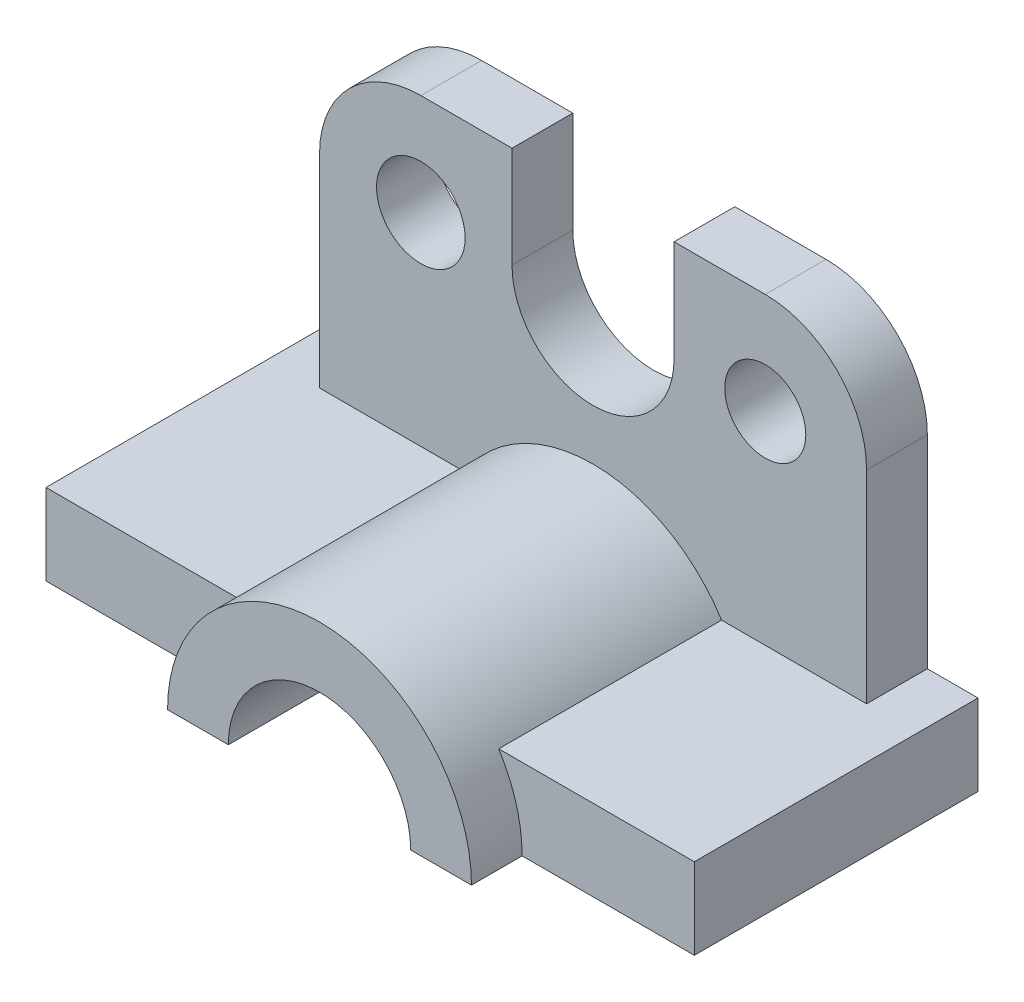
ISO-10303-21;
HEADER;
FILE_DESCRIPTION(('STEP AP214'),'2;1');
FILE_NAME('part.step','',(''),(''),'','','');
FILE_SCHEMA(('AUTOMOTIVE_DESIGN { 1 0 10303 214 1 1 1 1 }'));
ENDSEC;
DATA;
#1=APPLICATION_CONTEXT('core data for automotive mechanical design processes');
#2=APPLICATION_PROTOCOL_DEFINITION('international standard','automotive_design',2000,#1);
#3=PRODUCT_CONTEXT('',#1,'mechanical');
#4=PRODUCT('Part','Part','',(#3));
#5=PRODUCT_RELATED_PRODUCT_CATEGORY('part','',(#4));
#6=PRODUCT_DEFINITION_FORMATION('','',#4);
#7=PRODUCT_DEFINITION_CONTEXT('part definition',#1,'design');
#8=PRODUCT_DEFINITION('design','',#6,#7);
#9=PRODUCT_DEFINITION_SHAPE('','',#8);
#10=(LENGTH_UNIT() NAMED_UNIT(*) SI_UNIT(.MILLI.,.METRE.));
#11=(NAMED_UNIT(*) PLANE_ANGLE_UNIT() SI_UNIT($,.RADIAN.));
#12=(NAMED_UNIT(*) SI_UNIT($,.STERADIAN.) SOLID_ANGLE_UNIT());
#13=UNCERTAINTY_MEASURE_WITH_UNIT(LENGTH_MEASURE(1.E-05),#10,'distance_accuracy_value','');
#14=(GEOMETRIC_REPRESENTATION_CONTEXT(3) GLOBAL_UNCERTAINTY_ASSIGNED_CONTEXT((#13)) GLOBAL_UNIT_ASSIGNED_CONTEXT((#10,
#11,#12)) REPRESENTATION_CONTEXT('',''));
#15=CARTESIAN_POINT('',(0.,0.,0.));
#16=DIRECTION('',(0.,0.,1.));
#17=DIRECTION('',(1.,0.,0.));
#18=AXIS2_PLACEMENT_3D('',#15,#16,#17);
#19=CARTESIAN_POINT('',(0.,38.,0.));
#20=DIRECTION('',(0.,1.,0.));
#21=DIRECTION('',(0.,0.,1.));
#22=AXIS2_PLACEMENT_3D('',#19,#20,#21);
#23=PLANE('',#22);
#24=DIRECTION('',(0.,0.,1.));
#25=VECTOR('',#24,1.);
#26=CARTESIAN_POINT('',(-8.,38.,0.));
#27=LINE('',#26,#25);
#28=CARTESIAN_POINT('',(-8.,38.,-14.));
#29=VERTEX_POINT('',#28);
#30=CARTESIAN_POINT('',(-8.,38.,-8.00000000000001));
#31=VERTEX_POINT('',#30);
#32=EDGE_CURVE('E49',#29,#31,#27,.T.);
#33=ORIENTED_EDGE('',*,*,#32,.F.);
#34=DIRECTION('',(-1.,0.,0.));
#35=VECTOR('',#34,1.);
#36=CARTESIAN_POINT('',(-27.,38.,-14.));
#37=LINE('',#36,#35);
#38=CARTESIAN_POINT('',(-17.,38.,-14.));
#39=VERTEX_POINT('',#38);
#40=EDGE_CURVE('E258',#29,#39,#37,.T.);
#41=ORIENTED_EDGE('',*,*,#40,.T.);
#42=DIRECTION('',(0.,0.,1.));
#43=VECTOR('',#42,1.);
#44=CARTESIAN_POINT('',(-17.,38.,-8.));
#45=LINE('',#44,#43);
#46=CARTESIAN_POINT('',(-17.,38.,-8.));
#47=VERTEX_POINT('',#46);
#48=EDGE_CURVE('E339',#39,#47,#45,.T.);
#49=ORIENTED_EDGE('',*,*,#48,.T.);
#50=DIRECTION('',(1.,0.,0.));
#51=VECTOR('',#50,1.);
#52=CARTESIAN_POINT('',(-27.,38.,-8.));
#53=LINE('',#52,#51);
#54=EDGE_CURVE('E254',#47,#31,#53,.T.);
#55=ORIENTED_EDGE('',*,*,#54,.T.);
#56=EDGE_LOOP('',(#33,#41,#49,#55));
#57=FACE_BOUND('',#56,.T.);
#58=ADVANCED_FACE('F39',(#57),#23,.T.);
#59=CARTESIAN_POINT('',(-32.,8.,-14.));
#60=DIRECTION('',(0.,0.,1.));
#61=DIRECTION('',(1.,0.,0.));
#62=AXIS2_PLACEMENT_3D('',#59,#60,#61);
#63=PLANE('',#62);
#64=CARTESIAN_POINT('',(17.,28.,-14.));
#65=DIRECTION('',(0.,0.,1.));
#66=DIRECTION('',(1.,0.,0.));
#67=AXIS2_PLACEMENT_3D('',#64,#65,#66);
#68=CIRCLE('',#67,4.);
#69=CARTESIAN_POINT('',(21.,28.,-14.));
#70=VERTEX_POINT('',#69);
#71=EDGE_CURVE('E215',#70,#70,#68,.T.);
#72=ORIENTED_EDGE('',*,*,#71,.T.);
#73=EDGE_LOOP('',(#72));
#74=FACE_BOUND('',#73,.T.);
#75=CARTESIAN_POINT('',(-17.,28.,-14.));
#76=DIRECTION('',(0.,0.,1.));
#77=DIRECTION('',(1.,0.,0.));
#78=AXIS2_PLACEMENT_3D('',#75,#76,#77);
#79=CIRCLE('',#78,4.37233720581108);
#80=CARTESIAN_POINT('',(-12.6276627941889,28.,-14.));
#81=VERTEX_POINT('',#80);
#82=EDGE_CURVE('E208',#81,#81,#79,.T.);
#83=ORIENTED_EDGE('',*,*,#82,.T.);
#84=EDGE_LOOP('',(#83));
#85=FACE_BOUND('',#84,.T.);
#86=ORIENTED_EDGE('',*,*,#40,.F.);
#87=DIRECTION('',(0.,-1.,0.));
#88=VECTOR('',#87,1.);
#89=CARTESIAN_POINT('',(-8.,8.,-14.));
#90=LINE('',#89,#88);
#91=CARTESIAN_POINT('',(-8.,28.,-14.));
#92=VERTEX_POINT('',#91);
#93=EDGE_CURVE('E201',#29,#92,#90,.T.);
#94=ORIENTED_EDGE('',*,*,#93,.T.);
#95=CARTESIAN_POINT('',(0.,28.,-14.));
#96=DIRECTION('',(0.,0.,1.));
#97=DIRECTION('',(1.,0.,0.));
#98=AXIS2_PLACEMENT_3D('',#95,#96,#97);
#99=CIRCLE('',#98,8.);
#100=CARTESIAN_POINT('',(8.,28.,-14.));
#101=VERTEX_POINT('',#100);
#102=EDGE_CURVE('E193',#92,#101,#99,.T.);
#103=ORIENTED_EDGE('',*,*,#102,.T.);
#104=DIRECTION('',(0.,1.,0.));
#105=VECTOR('',#104,1.);
#106=CARTESIAN_POINT('',(8.,8.,-14.));
#107=LINE('',#106,#105);
#108=CARTESIAN_POINT('',(8.,38.,-14.));
#109=VERTEX_POINT('',#108);
#110=EDGE_CURVE('E178',#101,#109,#107,.T.);
#111=ORIENTED_EDGE('',*,*,#110,.T.);
#112=CARTESIAN_POINT('',(17.,38.,-14.));
#113=VERTEX_POINT('',#112);
#114=EDGE_CURVE('E260',#113,#109,#37,.T.);
#115=ORIENTED_EDGE('',*,*,#114,.F.);
#116=CARTESIAN_POINT('',(17.,28.,-14.));
#117=DIRECTION('',(0.,0.,1.));
#118=DIRECTION('',(1.,0.,0.));
#119=AXIS2_PLACEMENT_3D('',#116,#117,#118);
#120=CIRCLE('',#119,10.);
#121=CARTESIAN_POINT('',(27.,28.,-14.));
#122=VERTEX_POINT('',#121);
#123=EDGE_CURVE('E351',#113,#122,#120,.F.);
#124=ORIENTED_EDGE('',*,*,#123,.T.);
#125=DIRECTION('',(0.,-1.,0.));
#126=VECTOR('',#125,1.);
#127=CARTESIAN_POINT('',(27.,38.,-14.));
#128=LINE('',#127,#126);
#129=CARTESIAN_POINT('',(27.,8.,-14.));
#130=VERTEX_POINT('',#129);
#131=EDGE_CURVE('E266',#122,#130,#128,.T.);
#132=ORIENTED_EDGE('',*,*,#131,.T.);
#133=DIRECTION('',(-1.,0.,0.));
#134=VECTOR('',#133,1.);
#135=CARTESIAN_POINT('',(-32.,8.,-14.));
#136=LINE('',#135,#134);
#137=CARTESIAN_POINT('',(32.,8.,-14.));
#138=VERTEX_POINT('',#137);
#139=EDGE_CURVE('E296',#138,#130,#136,.T.);
#140=ORIENTED_EDGE('',*,*,#139,.F.);
#141=DIRECTION('',(0.,-1.,0.));
#142=VECTOR('',#141,1.);
#143=CARTESIAN_POINT('',(32.,8.,-14.));
#144=LINE('',#143,#142);
#145=CARTESIAN_POINT('',(32.,0.,-14.));
#146=VERTEX_POINT('',#145);
#147=EDGE_CURVE('E335',#138,#146,#144,.T.);
#148=ORIENTED_EDGE('',*,*,#147,.T.);
#149=DIRECTION('',(-1.,0.,0.));
#150=VECTOR('',#149,1.);
#151=CARTESIAN_POINT('',(-32.,0.,-14.));
#152=LINE('',#151,#150);
#153=CARTESIAN_POINT('',(9.,0.,-14.));
#154=VERTEX_POINT('',#153);
#155=EDGE_CURVE('E313',#146,#154,#152,.T.);
#156=ORIENTED_EDGE('',*,*,#155,.T.);
#157=CARTESIAN_POINT('',(0.,0.,-14.));
#158=DIRECTION('',(0.,0.,1.));
#159=DIRECTION('',(1.,0.,0.));
#160=AXIS2_PLACEMENT_3D('',#157,#158,#159);
#161=CIRCLE('',#160,9.);
#162=CARTESIAN_POINT('',(-9.,0.,-14.));
#163=VERTEX_POINT('',#162);
#164=EDGE_CURVE('E224',#163,#154,#161,.F.);
#165=ORIENTED_EDGE('',*,*,#164,.F.);
#166=CARTESIAN_POINT('',(-32.,0.,-14.));
#167=VERTEX_POINT('',#166);
#168=EDGE_CURVE('E312',#163,#167,#152,.T.);
#169=ORIENTED_EDGE('',*,*,#168,.T.);
#170=DIRECTION('',(0.,-1.,0.));
#171=VECTOR('',#170,1.);
#172=CARTESIAN_POINT('',(-32.,8.,-14.));
#173=LINE('',#172,#171);
#174=CARTESIAN_POINT('',(-32.,8.,-14.));
#175=VERTEX_POINT('',#174);
#176=EDGE_CURVE('E331',#175,#167,#173,.T.);
#177=ORIENTED_EDGE('',*,*,#176,.F.);
#178=CARTESIAN_POINT('',(-27.,8.,-14.));
#179=VERTEX_POINT('',#178);
#180=EDGE_CURVE('E294',#179,#175,#136,.T.);
#181=ORIENTED_EDGE('',*,*,#180,.F.);
#182=DIRECTION('',(0.,-1.,0.));
#183=VECTOR('',#182,1.);
#184=CARTESIAN_POINT('',(-27.,38.,-14.));
#185=LINE('',#184,#183);
#186=CARTESIAN_POINT('',(-27.,28.,-14.));
#187=VERTEX_POINT('',#186);
#188=EDGE_CURVE('E263',#187,#179,#185,.T.);
#189=ORIENTED_EDGE('',*,*,#188,.F.);
#190=CARTESIAN_POINT('',(-17.,28.,-14.));
#191=DIRECTION('',(0.,0.,1.));
#192=DIRECTION('',(1.,0.,0.));
#193=AXIS2_PLACEMENT_3D('',#190,#191,#192);
#194=CIRCLE('',#193,10.);
#195=EDGE_CURVE('E347',#187,#39,#194,.F.);
#196=ORIENTED_EDGE('',*,*,#195,.T.);
#197=EDGE_LOOP('',(#86,#94,#103,#111,#115,#124,#132,#140,#148,#156,#165,#169,#177,#181,#189,#196));
#198=FACE_BOUND('',#197,.T.);
#199=ADVANCED_FACE('F200',(#74,#85,#198),#63,.F.);
#200=CARTESIAN_POINT('',(0.,0.,0.));
#201=DIRECTION('',(0.,1.,0.));
#202=DIRECTION('',(0.,0.,1.));
#203=AXIS2_PLACEMENT_3D('',#200,#201,#202);
#204=PLANE('',#203);
#205=DIRECTION('',(0.,0.,-1.));
#206=VECTOR('',#205,1.);
#207=CARTESIAN_POINT('',(9.,0.,21.));
#208=LINE('',#207,#206);
#209=CARTESIAN_POINT('',(9.,0.,19.));
#210=VERTEX_POINT('',#209);
#211=EDGE_CURVE('E65',#210,#154,#208,.T.);
#212=ORIENTED_EDGE('',*,*,#211,.T.);
#213=ORIENTED_EDGE('',*,*,#155,.F.);
#214=DIRECTION('',(0.,0.,-1.));
#215=VECTOR('',#214,1.);
#216=CARTESIAN_POINT('',(32.,0.,-14.));
#217=LINE('',#216,#215);
#218=CARTESIAN_POINT('',(32.,0.,14.));
#219=VERTEX_POINT('',#218);
#220=EDGE_CURVE('E289',#219,#146,#217,.T.);
#221=ORIENTED_EDGE('',*,*,#220,.F.);
#222=DIRECTION('',(1.,0.,0.));
#223=VECTOR('',#222,1.);
#224=CARTESIAN_POINT('',(-32.,0.,14.));
#225=LINE('',#224,#223);
#226=CARTESIAN_POINT('',(15.,0.,14.));
#227=VERTEX_POINT('',#226);
#228=EDGE_CURVE('E320',#227,#219,#225,.T.);
#229=ORIENTED_EDGE('',*,*,#228,.F.);
#230=DIRECTION('',(0.,0.,1.));
#231=VECTOR('',#230,1.);
#232=CARTESIAN_POINT('',(15.,0.,-13.));
#233=LINE('',#232,#231);
#234=CARTESIAN_POINT('',(15.,0.,19.));
#235=VERTEX_POINT('',#234);
#236=EDGE_CURVE('E237',#227,#235,#233,.T.);
#237=ORIENTED_EDGE('',*,*,#236,.T.);
#238=DIRECTION('',(1.,0.,0.));
#239=VECTOR('',#238,1.);
#240=CARTESIAN_POINT('',(-15.,0.,19.));
#241=LINE('',#240,#239);
#242=EDGE_CURVE('E231',#210,#235,#241,.T.);
#243=ORIENTED_EDGE('',*,*,#242,.F.);
#244=EDGE_LOOP('',(#212,#213,#221,#229,#237,#243));
#245=FACE_BOUND('',#244,.T.);
#246=ADVANCED_FACE('F422',(#245),#204,.F.);
#247=DIRECTION('',(0.,0.,-1.));
#248=VECTOR('',#247,1.);
#249=CARTESIAN_POINT('',(-9.,0.,21.));
#250=LINE('',#249,#248);
#251=CARTESIAN_POINT('',(-9.,0.,19.));
#252=VERTEX_POINT('',#251);
#253=EDGE_CURVE('E221',#252,#163,#250,.T.);
#254=ORIENTED_EDGE('',*,*,#253,.F.);
#255=CARTESIAN_POINT('',(-15.,0.,19.));
#256=VERTEX_POINT('',#255);
#257=EDGE_CURVE('E232',#256,#252,#241,.T.);
#258=ORIENTED_EDGE('',*,*,#257,.F.);
#259=DIRECTION('',(0.,0.,1.));
#260=VECTOR('',#259,1.);
#261=CARTESIAN_POINT('',(-15.,0.,-13.));
#262=LINE('',#261,#260);
#263=CARTESIAN_POINT('',(-15.,0.,14.));
#264=VERTEX_POINT('',#263);
#265=EDGE_CURVE('E236',#264,#256,#262,.T.);
#266=ORIENTED_EDGE('',*,*,#265,.F.);
#267=CARTESIAN_POINT('',(-32.,0.,14.));
#268=VERTEX_POINT('',#267);
#269=EDGE_CURVE('E295',#268,#264,#225,.T.);
#270=ORIENTED_EDGE('',*,*,#269,.F.);
#271=DIRECTION('',(0.,0.,1.));
#272=VECTOR('',#271,1.);
#273=CARTESIAN_POINT('',(-32.,0.,-14.));
#274=LINE('',#273,#272);
#275=EDGE_CURVE('E317',#167,#268,#274,.T.);
#276=ORIENTED_EDGE('',*,*,#275,.F.);
#277=ORIENTED_EDGE('',*,*,#168,.F.);
#278=EDGE_LOOP('',(#254,#258,#266,#270,#276,#277));
#279=FACE_BOUND('',#278,.T.);
#280=ADVANCED_FACE('F484',(#279),#204,.F.);
#281=CARTESIAN_POINT('',(0.,0.,19.));
#282=DIRECTION('',(0.,0.,1.));
#283=DIRECTION('',(1.,0.,0.));
#284=AXIS2_PLACEMENT_3D('',#281,#282,#283);
#285=PLANE('',#284);
#286=ORIENTED_EDGE('',*,*,#257,.T.);
#287=CARTESIAN_POINT('',(0.,0.,19.));
#288=DIRECTION('',(0.,0.,1.));
#289=DIRECTION('',(1.,0.,0.));
#290=AXIS2_PLACEMENT_3D('',#287,#288,#289);
#291=CIRCLE('',#290,9.);
#292=EDGE_CURVE('E371',#252,#210,#291,.F.);
#293=ORIENTED_EDGE('',*,*,#292,.T.);
#294=ORIENTED_EDGE('',*,*,#242,.T.);
#295=CARTESIAN_POINT('',(0.,0.,19.));
#296=DIRECTION('',(0.,0.,1.));
#297=DIRECTION('',(1.,0.,0.));
#298=AXIS2_PLACEMENT_3D('',#295,#296,#297);
#299=CIRCLE('',#298,15.);
#300=EDGE_CURVE('E227',#235,#256,#299,.T.);
#301=ORIENTED_EDGE('',*,*,#300,.T.);
#302=EDGE_LOOP('',(#286,#293,#294,#301));
#303=FACE_BOUND('',#302,.T.);
#304=ADVANCED_FACE('F492',(#303),#285,.T.);
#305=CARTESIAN_POINT('',(0.,8.,0.));
#306=DIRECTION('',(0.,1.,0.));
#307=DIRECTION('',(0.,0.,1.));
#308=AXIS2_PLACEMENT_3D('',#305,#306,#307);
#309=PLANE('',#308);
#310=DIRECTION('',(0.,0.,1.));
#311=VECTOR('',#310,1.);
#312=CARTESIAN_POINT('',(-12.6885775404495,8.,-13.));
#313=LINE('',#312,#311);
#314=CARTESIAN_POINT('',(-12.6885775404495,8.,-8.));
#315=VERTEX_POINT('',#314);
#316=CARTESIAN_POINT('',(-12.6885775404495,8.,14.));
#317=VERTEX_POINT('',#316);
#318=EDGE_CURVE('E246',#315,#317,#313,.T.);
#319=ORIENTED_EDGE('',*,*,#318,.F.);
#320=DIRECTION('',(-1.,0.,0.));
#321=VECTOR('',#320,1.);
#322=CARTESIAN_POINT('',(0.,8.,-8.));
#323=LINE('',#322,#321);
#324=CARTESIAN_POINT('',(-27.,8.,-8.));
#325=VERTEX_POINT('',#324);
#326=EDGE_CURVE('E280',#315,#325,#323,.T.);
#327=ORIENTED_EDGE('',*,*,#326,.T.);
#328=DIRECTION('',(0.,0.,-1.));
#329=VECTOR('',#328,1.);
#330=CARTESIAN_POINT('',(-27.,8.,0.));
#331=LINE('',#330,#329);
#332=EDGE_CURVE('E285',#325,#179,#331,.T.);
#333=ORIENTED_EDGE('',*,*,#332,.T.);
#334=ORIENTED_EDGE('',*,*,#180,.T.);
#335=DIRECTION('',(0.,0.,1.));
#336=VECTOR('',#335,1.);
#337=CARTESIAN_POINT('',(-32.,8.,-14.));
#338=LINE('',#337,#336);
#339=CARTESIAN_POINT('',(-32.,8.,14.));
#340=VERTEX_POINT('',#339);
#341=EDGE_CURVE('E300',#175,#340,#338,.T.);
#342=ORIENTED_EDGE('',*,*,#341,.T.);
#343=DIRECTION('',(1.,0.,0.));
#344=VECTOR('',#343,1.);
#345=CARTESIAN_POINT('',(-32.,8.,14.));
#346=LINE('',#345,#344);
#347=EDGE_CURVE('E304',#340,#317,#346,.T.);
#348=ORIENTED_EDGE('',*,*,#347,.T.);
#349=EDGE_LOOP('',(#319,#327,#333,#334,#342,#348));
#350=FACE_BOUND('',#349,.T.);
#351=ADVANCED_FACE('F399',(#350),#309,.T.);
#352=CARTESIAN_POINT('',(-32.,8.,14.));
#353=DIRECTION('',(0.,0.,-1.));
#354=DIRECTION('',(-1.,0.,0.));
#355=AXIS2_PLACEMENT_3D('',#352,#353,#354);
#356=PLANE('',#355);
#357=ORIENTED_EDGE('',*,*,#269,.T.);
#358=CARTESIAN_POINT('',(0.,0.,14.));
#359=DIRECTION('',(0.,0.,-1.));
#360=DIRECTION('',(-1.,0.,0.));
#361=AXIS2_PLACEMENT_3D('',#358,#359,#360);
#362=CIRCLE('',#361,15.);
#363=EDGE_CURVE('E253',#264,#317,#362,.T.);
#364=ORIENTED_EDGE('',*,*,#363,.T.);
#365=ORIENTED_EDGE('',*,*,#347,.F.);
#366=DIRECTION('',(0.,-1.,0.));
#367=VECTOR('',#366,1.);
#368=CARTESIAN_POINT('',(-32.,8.,14.));
#369=LINE('',#368,#367);
#370=EDGE_CURVE('E327',#340,#268,#369,.T.);
#371=ORIENTED_EDGE('',*,*,#370,.T.);
#372=EDGE_LOOP('',(#357,#364,#365,#371));
#373=FACE_BOUND('',#372,.T.);
#374=ADVANCED_FACE('F488',(#373),#356,.F.);
#375=DIRECTION('',(0.,0.,1.));
#376=VECTOR('',#375,1.);
#377=CARTESIAN_POINT('',(12.6885775404495,8.,-13.));
#378=LINE('',#377,#376);
#379=CARTESIAN_POINT('',(12.6885775404495,8.,14.));
#380=VERTEX_POINT('',#379);
#381=CARTESIAN_POINT('',(12.6885775404495,8.,-8.));
#382=VERTEX_POINT('',#381);
#383=EDGE_CURVE('E241',#380,#382,#378,.F.);
#384=ORIENTED_EDGE('',*,*,#383,.F.);
#385=CARTESIAN_POINT('',(32.,8.,14.));
#386=VERTEX_POINT('',#385);
#387=EDGE_CURVE('E303',#380,#386,#346,.T.);
#388=ORIENTED_EDGE('',*,*,#387,.T.);
#389=DIRECTION('',(0.,0.,-1.));
#390=VECTOR('',#389,1.);
#391=CARTESIAN_POINT('',(32.,8.,-14.));
#392=LINE('',#391,#390);
#393=EDGE_CURVE('E290',#386,#138,#392,.T.);
#394=ORIENTED_EDGE('',*,*,#393,.T.);
#395=ORIENTED_EDGE('',*,*,#139,.T.);
#396=DIRECTION('',(0.,0.,1.));
#397=VECTOR('',#396,1.);
#398=CARTESIAN_POINT('',(27.,8.,0.));
#399=LINE('',#398,#397);
#400=CARTESIAN_POINT('',(27.,8.,-8.));
#401=VERTEX_POINT('',#400);
#402=EDGE_CURVE('E276',#130,#401,#399,.T.);
#403=ORIENTED_EDGE('',*,*,#402,.T.);
#404=EDGE_CURVE('E281',#401,#382,#323,.T.);
#405=ORIENTED_EDGE('',*,*,#404,.T.);
#406=EDGE_LOOP('',(#384,#388,#394,#395,#403,#405));
#407=FACE_BOUND('',#406,.T.);
#408=ADVANCED_FACE('F461',(#407),#309,.T.);
#409=CARTESIAN_POINT('',(32.,8.,-14.));
#410=DIRECTION('',(-1.,0.,0.));
#411=DIRECTION('',(0.,0.,1.));
#412=AXIS2_PLACEMENT_3D('',#409,#410,#411);
#413=PLANE('',#412);
#414=ORIENTED_EDGE('',*,*,#220,.T.);
#415=ORIENTED_EDGE('',*,*,#147,.F.);
#416=ORIENTED_EDGE('',*,*,#393,.F.);
#417=DIRECTION('',(0.,-1.,0.));
#418=VECTOR('',#417,1.);
#419=CARTESIAN_POINT('',(32.,8.,14.));
#420=LINE('',#419,#418);
#421=EDGE_CURVE('E308',#386,#219,#420,.T.);
#422=ORIENTED_EDGE('',*,*,#421,.T.);
#423=EDGE_LOOP('',(#414,#415,#416,#422));
#424=FACE_BOUND('',#423,.T.);
#425=ADVANCED_FACE('F497',(#424),#413,.F.);
#426=CARTESIAN_POINT('',(-32.,8.,-14.));
#427=DIRECTION('',(1.,0.,0.));
#428=DIRECTION('',(0.,0.,-1.));
#429=AXIS2_PLACEMENT_3D('',#426,#427,#428);
#430=PLANE('',#429);
#431=ORIENTED_EDGE('',*,*,#275,.T.);
#432=ORIENTED_EDGE('',*,*,#370,.F.);
#433=ORIENTED_EDGE('',*,*,#341,.F.);
#434=ORIENTED_EDGE('',*,*,#176,.T.);
#435=EDGE_LOOP('',(#431,#432,#433,#434));
#436=FACE_BOUND('',#435,.T.);
#437=ADVANCED_FACE('F481',(#436),#430,.F.);
#438=ORIENTED_EDGE('',*,*,#387,.F.);
#439=EDGE_CURVE('E249',#380,#227,#362,.T.);
#440=ORIENTED_EDGE('',*,*,#439,.T.);
#441=ORIENTED_EDGE('',*,*,#228,.T.);
#442=ORIENTED_EDGE('',*,*,#421,.F.);
#443=EDGE_LOOP('',(#438,#440,#441,#442));
#444=FACE_BOUND('',#443,.T.);
#445=ADVANCED_FACE('F467',(#444),#356,.F.);
#446=CARTESIAN_POINT('',(-27.,38.,-14.));
#447=DIRECTION('',(1.,0.,0.));
#448=DIRECTION('',(0.,0.,-1.));
#449=AXIS2_PLACEMENT_3D('',#446,#447,#448);
#450=PLANE('',#449);
#451=DIRECTION('',(0.,-1.,0.));
#452=VECTOR('',#451,1.);
#453=CARTESIAN_POINT('',(-27.,38.,-8.));
#454=LINE('',#453,#452);
#455=CARTESIAN_POINT('',(-27.,28.,-8.));
#456=VERTEX_POINT('',#455);
#457=EDGE_CURVE('E272',#456,#325,#454,.T.);
#458=ORIENTED_EDGE('',*,*,#457,.F.);
#459=DIRECTION('',(0.,0.,1.));
#460=VECTOR('',#459,1.);
#461=CARTESIAN_POINT('',(-27.,28.,-14.));
#462=LINE('',#461,#460);
#463=EDGE_CURVE('E364',#456,#187,#462,.F.);
#464=ORIENTED_EDGE('',*,*,#463,.T.);
#465=ORIENTED_EDGE('',*,*,#188,.T.);
#466=ORIENTED_EDGE('',*,*,#332,.F.);
#467=EDGE_LOOP('',(#458,#464,#465,#466));
#468=FACE_BOUND('',#467,.T.);
#469=ADVANCED_FACE('F394',(#468),#450,.F.);
#470=CARTESIAN_POINT('',(-27.,38.,-8.));
#471=DIRECTION('',(0.,0.,-1.));
#472=DIRECTION('',(-1.,0.,0.));
#473=AXIS2_PLACEMENT_3D('',#470,#471,#472);
#474=PLANE('',#473);
#475=CARTESIAN_POINT('',(17.,28.,-8.00000000000001));
#476=DIRECTION('',(0.,0.,-1.));
#477=DIRECTION('',(-1.,0.,0.));
#478=AXIS2_PLACEMENT_3D('',#475,#476,#477);
#479=CIRCLE('',#478,4.);
#480=CARTESIAN_POINT('',(13.,28.,-8.00000000000001));
#481=VERTEX_POINT('',#480);
#482=EDGE_CURVE('E43',#481,#481,#479,.T.);
#483=ORIENTED_EDGE('',*,*,#482,.T.);
#484=EDGE_LOOP('',(#483));
#485=FACE_BOUND('',#484,.T.);
#486=CARTESIAN_POINT('',(-17.,28.,-8.00000000000001));
#487=DIRECTION('',(0.,0.,-1.));
#488=DIRECTION('',(-1.,0.,0.));
#489=AXIS2_PLACEMENT_3D('',#486,#487,#488);
#490=CIRCLE('',#489,4.37233720581108);
#491=CARTESIAN_POINT('',(-21.3723372058111,28.,-8.00000000000001));
#492=VERTEX_POINT('',#491);
#493=EDGE_CURVE('E203',#492,#492,#490,.T.);
#494=ORIENTED_EDGE('',*,*,#493,.T.);
#495=EDGE_LOOP('',(#494));
#496=FACE_BOUND('',#495,.T.);
#497=CARTESIAN_POINT('',(0.,28.,-8.00000000000001));
#498=DIRECTION('',(0.,0.,-1.));
#499=DIRECTION('',(-1.,0.,0.));
#500=AXIS2_PLACEMENT_3D('',#497,#498,#499);
#501=CIRCLE('',#500,8.);
#502=CARTESIAN_POINT('',(8.,28.,-8.00000000000001));
#503=VERTEX_POINT('',#502);
#504=CARTESIAN_POINT('',(-8.,28.,-8.00000000000001));
#505=VERTEX_POINT('',#504);
#506=EDGE_CURVE('E11',#503,#505,#501,.T.);
#507=ORIENTED_EDGE('',*,*,#506,.T.);
#508=DIRECTION('',(0.,1.,0.));
#509=VECTOR('',#508,1.);
#510=CARTESIAN_POINT('',(-8.,38.,-8.));
#511=LINE('',#510,#509);
#512=EDGE_CURVE('E188',#505,#31,#511,.T.);
#513=ORIENTED_EDGE('',*,*,#512,.T.);
#514=ORIENTED_EDGE('',*,*,#54,.F.);
#515=CARTESIAN_POINT('',(-17.,28.,-8.));
#516=DIRECTION('',(0.,0.,-1.));
#517=DIRECTION('',(-1.,0.,0.));
#518=AXIS2_PLACEMENT_3D('',#515,#516,#517);
#519=CIRCLE('',#518,10.);
#520=EDGE_CURVE('E357',#47,#456,#519,.F.);
#521=ORIENTED_EDGE('',*,*,#520,.T.);
#522=ORIENTED_EDGE('',*,*,#457,.T.);
#523=ORIENTED_EDGE('',*,*,#326,.F.);
#524=CARTESIAN_POINT('',(0.,0.,-8.));
#525=DIRECTION('',(0.,0.,-1.));
#526=DIRECTION('',(-1.,0.,0.));
#527=AXIS2_PLACEMENT_3D('',#524,#525,#526);
#528=CIRCLE('',#527,15.);
#529=EDGE_CURVE('E367',#315,#382,#528,.T.);
#530=ORIENTED_EDGE('',*,*,#529,.T.);
#531=ORIENTED_EDGE('',*,*,#404,.F.);
#532=DIRECTION('',(0.,-1.,0.));
#533=VECTOR('',#532,1.);
#534=CARTESIAN_POINT('',(27.,38.,-8.));
#535=LINE('',#534,#533);
#536=CARTESIAN_POINT('',(27.,28.,-8.));
#537=VERTEX_POINT('',#536);
#538=EDGE_CURVE('E269',#537,#401,#535,.T.);
#539=ORIENTED_EDGE('',*,*,#538,.F.);
#540=CARTESIAN_POINT('',(17.,28.,-8.));
#541=DIRECTION('',(0.,0.,-1.));
#542=DIRECTION('',(-1.,0.,0.));
#543=AXIS2_PLACEMENT_3D('',#540,#541,#542);
#544=CIRCLE('',#543,10.);
#545=CARTESIAN_POINT('',(17.,38.,-8.));
#546=VERTEX_POINT('',#545);
#547=EDGE_CURVE('E360',#537,#546,#544,.F.);
#548=ORIENTED_EDGE('',*,*,#547,.T.);
#549=CARTESIAN_POINT('',(8.,38.,-8.));
#550=VERTEX_POINT('',#549);
#551=EDGE_CURVE('E259',#550,#546,#53,.T.);
#552=ORIENTED_EDGE('',*,*,#551,.F.);
#553=DIRECTION('',(0.,-1.,0.));
#554=VECTOR('',#553,1.);
#555=CARTESIAN_POINT('',(8.,38.,-8.));
#556=LINE('',#555,#554);
#557=EDGE_CURVE('E57',#550,#503,#556,.T.);
#558=ORIENTED_EDGE('',*,*,#557,.T.);
#559=EDGE_LOOP('',(#507,#513,#514,#521,#522,#523,#530,#531,#539,#548,#552,#558));
#560=FACE_BOUND('',#559,.T.);
#561=ADVANCED_FACE('F384',(#485,#496,#560),#474,.F.);
#562=CARTESIAN_POINT('',(27.,38.,-14.));
#563=DIRECTION('',(-1.,0.,0.));
#564=DIRECTION('',(0.,0.,1.));
#565=AXIS2_PLACEMENT_3D('',#562,#563,#564);
#566=PLANE('',#565);
#567=ORIENTED_EDGE('',*,*,#131,.F.);
#568=DIRECTION('',(0.,0.,-1.));
#569=VECTOR('',#568,1.);
#570=CARTESIAN_POINT('',(27.,28.,-8.));
#571=LINE('',#570,#569);
#572=EDGE_CURVE('E354',#122,#537,#571,.F.);
#573=ORIENTED_EDGE('',*,*,#572,.T.);
#574=ORIENTED_EDGE('',*,*,#538,.T.);
#575=ORIENTED_EDGE('',*,*,#402,.F.);
#576=EDGE_LOOP('',(#567,#573,#574,#575));
#577=FACE_BOUND('',#576,.T.);
#578=ADVANCED_FACE('F443',(#577),#566,.F.);
#579=DIRECTION('',(0.,0.,-1.));
#580=VECTOR('',#579,1.);
#581=CARTESIAN_POINT('',(8.,38.,0.));
#582=LINE('',#581,#580);
#583=EDGE_CURVE('E182',#550,#109,#582,.T.);
#584=ORIENTED_EDGE('',*,*,#583,.F.);
#585=ORIENTED_EDGE('',*,*,#551,.T.);
#586=DIRECTION('',(0.,0.,-1.));
#587=VECTOR('',#586,1.);
#588=CARTESIAN_POINT('',(17.,38.,-14.));
#589=LINE('',#588,#587);
#590=EDGE_CURVE('E343',#546,#113,#589,.T.);
#591=ORIENTED_EDGE('',*,*,#590,.T.);
#592=ORIENTED_EDGE('',*,*,#114,.T.);
#593=EDGE_LOOP('',(#584,#585,#591,#592));
#594=FACE_BOUND('',#593,.T.);
#595=ADVANCED_FACE('F436',(#594),#23,.T.);
#596=CARTESIAN_POINT('',(17.,28.,0.));
#597=DIRECTION('',(0.,0.,1.));
#598=DIRECTION('',(1.,0.,0.));
#599=AXIS2_PLACEMENT_3D('',#596,#597,#598);
#600=CYLINDRICAL_SURFACE('',#599,10.);
#601=ORIENTED_EDGE('',*,*,#547,.F.);
#602=ORIENTED_EDGE('',*,*,#572,.F.);
#603=ORIENTED_EDGE('',*,*,#123,.F.);
#604=ORIENTED_EDGE('',*,*,#590,.F.);
#605=EDGE_LOOP('',(#601,#602,#603,#604));
#606=FACE_BOUND('',#605,.T.);
#607=ADVANCED_FACE('F442',(#606),#600,.T.);
#608=CARTESIAN_POINT('',(-17.,28.,0.));
#609=DIRECTION('',(0.,0.,-1.));
#610=DIRECTION('',(-1.,0.,0.));
#611=AXIS2_PLACEMENT_3D('',#608,#609,#610);
#612=CYLINDRICAL_SURFACE('',#611,10.);
#613=ORIENTED_EDGE('',*,*,#195,.F.);
#614=ORIENTED_EDGE('',*,*,#463,.F.);
#615=ORIENTED_EDGE('',*,*,#520,.F.);
#616=ORIENTED_EDGE('',*,*,#48,.F.);
#617=EDGE_LOOP('',(#613,#614,#615,#616));
#618=FACE_BOUND('',#617,.T.);
#619=ADVANCED_FACE('F41',(#618),#612,.T.);
#620=CARTESIAN_POINT('',(0.,0.,-13.));
#621=DIRECTION('',(0.,0.,1.));
#622=DIRECTION('',(1.,0.,0.));
#623=AXIS2_PLACEMENT_3D('',#620,#621,#622);
#624=CYLINDRICAL_SURFACE('',#623,15.);
#625=ORIENTED_EDGE('',*,*,#363,.F.);
#626=ORIENTED_EDGE('',*,*,#265,.T.);
#627=ORIENTED_EDGE('',*,*,#300,.F.);
#628=ORIENTED_EDGE('',*,*,#236,.F.);
#629=ORIENTED_EDGE('',*,*,#439,.F.);
#630=ORIENTED_EDGE('',*,*,#383,.T.);
#631=ORIENTED_EDGE('',*,*,#529,.F.);
#632=ORIENTED_EDGE('',*,*,#318,.T.);
#633=EDGE_LOOP('',(#625,#626,#627,#628,#629,#630,#631,#632));
#634=FACE_BOUND('',#633,.T.);
#635=ADVANCED_FACE('F463',(#634),#624,.T.);
#636=CARTESIAN_POINT('',(0.,0.,21.));
#637=DIRECTION('',(0.,0.,-1.));
#638=DIRECTION('',(-1.,0.,0.));
#639=AXIS2_PLACEMENT_3D('',#636,#637,#638);
#640=CYLINDRICAL_SURFACE('',#639,9.);
#641=ORIENTED_EDGE('',*,*,#164,.T.);
#642=ORIENTED_EDGE('',*,*,#211,.F.);
#643=ORIENTED_EDGE('',*,*,#292,.F.);
#644=ORIENTED_EDGE('',*,*,#253,.T.);
#645=EDGE_LOOP('',(#641,#642,#643,#644));
#646=FACE_BOUND('',#645,.T.);
#647=ADVANCED_FACE('F578',(#646),#640,.F.);
#648=CARTESIAN_POINT('',(0.,28.,-100.));
#649=DIRECTION('',(0.,0.,1.));
#650=DIRECTION('',(1.,0.,0.));
#651=AXIS2_PLACEMENT_3D('',#648,#649,#650);
#652=CYLINDRICAL_SURFACE('',#651,8.);
#653=DIRECTION('',(0.,0.,1.));
#654=VECTOR('',#653,1.);
#655=CARTESIAN_POINT('',(-8.,28.,-100.));
#656=LINE('',#655,#654);
#657=EDGE_CURVE('E196',#92,#505,#656,.T.);
#658=ORIENTED_EDGE('',*,*,#657,.T.);
#659=ORIENTED_EDGE('',*,*,#506,.F.);
#660=DIRECTION('',(0.,0.,1.));
#661=VECTOR('',#660,1.);
#662=CARTESIAN_POINT('',(8.,28.,-100.));
#663=LINE('',#662,#661);
#664=EDGE_CURVE('E181',#101,#503,#663,.T.);
#665=ORIENTED_EDGE('',*,*,#664,.F.);
#666=ORIENTED_EDGE('',*,*,#102,.F.);
#667=EDGE_LOOP('',(#658,#659,#665,#666));
#668=FACE_BOUND('',#667,.T.);
#669=ADVANCED_FACE('F192',(#668),#652,.F.);
#670=CARTESIAN_POINT('',(-8.,28.,-100.));
#671=DIRECTION('',(-1.,0.,0.));
#672=DIRECTION('',(0.,0.,1.));
#673=AXIS2_PLACEMENT_3D('',#670,#671,#672);
#674=PLANE('',#673);
#675=ORIENTED_EDGE('',*,*,#32,.T.);
#676=ORIENTED_EDGE('',*,*,#512,.F.);
#677=ORIENTED_EDGE('',*,*,#657,.F.);
#678=ORIENTED_EDGE('',*,*,#93,.F.);
#679=EDGE_LOOP('',(#675,#676,#677,#678));
#680=FACE_BOUND('',#679,.T.);
#681=ADVANCED_FACE('F380',(#680),#674,.F.);
#682=CARTESIAN_POINT('',(8.,28.,-100.));
#683=DIRECTION('',(1.,0.,0.));
#684=DIRECTION('',(0.,0.,-1.));
#685=AXIS2_PLACEMENT_3D('',#682,#683,#684);
#686=PLANE('',#685);
#687=ORIENTED_EDGE('',*,*,#664,.T.);
#688=ORIENTED_EDGE('',*,*,#557,.F.);
#689=ORIENTED_EDGE('',*,*,#583,.T.);
#690=ORIENTED_EDGE('',*,*,#110,.F.);
#691=EDGE_LOOP('',(#687,#688,#689,#690));
#692=FACE_BOUND('',#691,.T.);
#693=ADVANCED_FACE('F180',(#692),#686,.F.);
#694=CARTESIAN_POINT('',(-17.,28.,-100.));
#695=DIRECTION('',(0.,0.,1.));
#696=DIRECTION('',(1.,0.,0.));
#697=AXIS2_PLACEMENT_3D('',#694,#695,#696);
#698=CYLINDRICAL_SURFACE('',#697,4.37233720581108);
#699=ORIENTED_EDGE('',*,*,#493,.F.);
#700=EDGE_LOOP('',(#699));
#701=FACE_BOUND('',#700,.T.);
#702=ORIENTED_EDGE('',*,*,#82,.F.);
#703=EDGE_LOOP('',(#702));
#704=FACE_BOUND('',#703,.T.);
#705=ADVANCED_FACE('F416',(#701,#704),#698,.F.);
#706=CARTESIAN_POINT('',(17.,28.,-100.));
#707=DIRECTION('',(0.,0.,1.));
#708=DIRECTION('',(1.,0.,0.));
#709=AXIS2_PLACEMENT_3D('',#706,#707,#708);
#710=CYLINDRICAL_SURFACE('',#709,4.);
#711=ORIENTED_EDGE('',*,*,#482,.F.);
#712=EDGE_LOOP('',(#711));
#713=FACE_BOUND('',#712,.T.);
#714=ORIENTED_EDGE('',*,*,#71,.F.);
#715=EDGE_LOOP('',(#714));
#716=FACE_BOUND('',#715,.T.);
#717=ADVANCED_FACE('F413',(#713,#716),#710,.F.);
#718=CLOSED_SHELL('',(#58,#199,#246,#280,#304,#351,#374,#408,#425,#437,#445,#469,#561,#578,#595,
#607,#619,#635,#647,#669,#681,#693,#705,#717));
#719=MANIFOLD_SOLID_BREP('B2',#718);
#720=ADVANCED_BREP_SHAPE_REPRESENTATION('',(#18,#719),#14);
#721=SHAPE_DEFINITION_REPRESENTATION(#9,#720);
ENDSEC;
END-ISO-10303-21;
